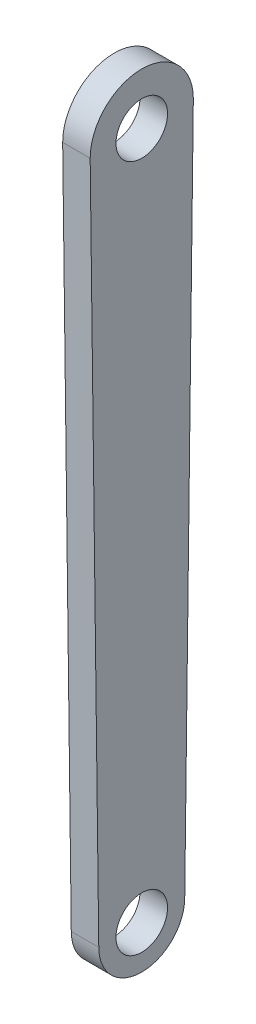
ISO-10303-21;
HEADER;
FILE_DESCRIPTION(('STEP AP214'),'2;1');
FILE_NAME('part.step','',(''),(''),'','','');
FILE_SCHEMA(('AUTOMOTIVE_DESIGN { 1 0 10303 214 1 1 1 1 }'));
ENDSEC;
DATA;
#1=APPLICATION_CONTEXT('core data for automotive mechanical design processes');
#2=APPLICATION_PROTOCOL_DEFINITION('international standard','automotive_design',2000,#1);
#3=PRODUCT_CONTEXT('',#1,'mechanical');
#4=PRODUCT('Part','Part','',(#3));
#5=PRODUCT_RELATED_PRODUCT_CATEGORY('part','',(#4));
#6=PRODUCT_DEFINITION_FORMATION('','',#4);
#7=PRODUCT_DEFINITION_CONTEXT('part definition',#1,'design');
#8=PRODUCT_DEFINITION('design','',#6,#7);
#9=PRODUCT_DEFINITION_SHAPE('','',#8);
#10=(LENGTH_UNIT() NAMED_UNIT(*) SI_UNIT(.MILLI.,.METRE.));
#11=(NAMED_UNIT(*) PLANE_ANGLE_UNIT() SI_UNIT($,.RADIAN.));
#12=(NAMED_UNIT(*) SI_UNIT($,.STERADIAN.) SOLID_ANGLE_UNIT());
#13=UNCERTAINTY_MEASURE_WITH_UNIT(LENGTH_MEASURE(1.E-05),#10,'distance_accuracy_value','');
#14=(GEOMETRIC_REPRESENTATION_CONTEXT(3) GLOBAL_UNCERTAINTY_ASSIGNED_CONTEXT((#13)) GLOBAL_UNIT_ASSIGNED_CONTEXT((#10,
#11,#12)) REPRESENTATION_CONTEXT('',''));
#15=CARTESIAN_POINT('',(0.,0.,0.));
#16=DIRECTION('',(0.,0.,1.));
#17=DIRECTION('',(1.,0.,0.));
#18=AXIS2_PLACEMENT_3D('',#15,#16,#17);
#19=CARTESIAN_POINT('',(8.,-200.,0.));
#20=DIRECTION('',(-1.,0.,0.));
#21=DIRECTION('',(0.,0.,1.));
#22=AXIS2_PLACEMENT_3D('',#19,#20,#21);
#23=CYLINDRICAL_SURFACE('',#22,12.5);
#24=CARTESIAN_POINT('',(0.,-200.,0.));
#25=DIRECTION('',(1.,0.,0.));
#26=DIRECTION('',(0.,0.,-1.));
#27=AXIS2_PLACEMENT_3D('',#24,#25,#26);
#28=CIRCLE('',#27,12.5);
#29=CARTESIAN_POINT('',(0.,-200.,12.5));
#30=VERTEX_POINT('',#29);
#31=CARTESIAN_POINT('',(0.,-200.,-12.5));
#32=VERTEX_POINT('',#31);
#33=EDGE_CURVE('E106',#30,#32,#28,.T.);
#34=ORIENTED_EDGE('',*,*,#33,.T.);
#35=DIRECTION('',(-1.,0.,0.));
#36=VECTOR('',#35,1.);
#37=CARTESIAN_POINT('',(8.,-200.,-12.5));
#38=LINE('',#37,#36);
#39=CARTESIAN_POINT('',(8.,-200.,-12.5));
#40=VERTEX_POINT('',#39);
#41=EDGE_CURVE('E11',#40,#32,#38,.T.);
#42=ORIENTED_EDGE('',*,*,#41,.F.);
#43=CARTESIAN_POINT('',(8.,-200.,0.));
#44=DIRECTION('',(1.,0.,0.));
#45=DIRECTION('',(0.,0.,-1.));
#46=AXIS2_PLACEMENT_3D('',#43,#44,#45);
#47=CIRCLE('',#46,12.5);
#48=CARTESIAN_POINT('',(8.,-200.,12.5));
#49=VERTEX_POINT('',#48);
#50=EDGE_CURVE('E81',#49,#40,#47,.T.);
#51=ORIENTED_EDGE('',*,*,#50,.F.);
#52=DIRECTION('',(-1.,0.,0.));
#53=VECTOR('',#52,1.);
#54=CARTESIAN_POINT('',(8.,-200.,12.5));
#55=LINE('',#54,#53);
#56=EDGE_CURVE('E56',#49,#30,#55,.T.);
#57=ORIENTED_EDGE('',*,*,#56,.T.);
#58=EDGE_LOOP('',(#34,#42,#51,#57));
#59=FACE_BOUND('',#58,.T.);
#60=ADVANCED_FACE('F38',(#59),#23,.T.);
#61=CARTESIAN_POINT('',(8.,-0.187470707701922,-14.9976566161537));
#62=DIRECTION('',(0.,-0.0124990235519261,-0.999921884154082));
#63=DIRECTION('',(0.,0.999921884154082,-0.0124990235519261));
#64=AXIS2_PLACEMENT_3D('',#61,#62,#63);
#65=PLANE('',#64);
#66=DIRECTION('',(0.,-0.999921884154082,0.0124990235519261));
#67=VECTOR('',#66,1.);
#68=CARTESIAN_POINT('',(0.,-0.187470707701922,-14.9976566161537));
#69=LINE('',#68,#67);
#70=CARTESIAN_POINT('',(0.,0.,-15.));
#71=VERTEX_POINT('',#70);
#72=EDGE_CURVE('E91',#71,#32,#69,.T.);
#73=ORIENTED_EDGE('',*,*,#72,.F.);
#74=DIRECTION('',(-1.,0.,0.));
#75=VECTOR('',#74,1.);
#76=CARTESIAN_POINT('',(8.,0.,-15.));
#77=LINE('',#76,#75);
#78=CARTESIAN_POINT('',(8.,0.,-15.));
#79=VERTEX_POINT('',#78);
#80=EDGE_CURVE('E47',#79,#71,#77,.T.);
#81=ORIENTED_EDGE('',*,*,#80,.F.);
#82=DIRECTION('',(0.,-0.999921884154082,0.0124990235519261));
#83=VECTOR('',#82,1.);
#84=CARTESIAN_POINT('',(8.,-0.187470707701922,-14.9976566161537));
#85=LINE('',#84,#83);
#86=EDGE_CURVE('E89',#79,#40,#85,.T.);
#87=ORIENTED_EDGE('',*,*,#86,.T.);
#88=ORIENTED_EDGE('',*,*,#41,.T.);
#89=EDGE_LOOP('',(#73,#81,#87,#88));
#90=FACE_BOUND('',#89,.T.);
#91=ADVANCED_FACE('F88',(#90),#65,.T.);
#92=CARTESIAN_POINT('',(8.,0.,0.));
#93=DIRECTION('',(-1.,0.,0.));
#94=DIRECTION('',(0.,0.,1.));
#95=AXIS2_PLACEMENT_3D('',#92,#93,#94);
#96=CYLINDRICAL_SURFACE('',#95,15.);
#97=CARTESIAN_POINT('',(0.,0.,0.));
#98=DIRECTION('',(1.,0.,0.));
#99=DIRECTION('',(0.,0.,-1.));
#100=AXIS2_PLACEMENT_3D('',#97,#98,#99);
#101=CIRCLE('',#100,15.);
#102=CARTESIAN_POINT('',(0.,0.,15.));
#103=VERTEX_POINT('',#102);
#104=EDGE_CURVE('E109',#71,#103,#101,.T.);
#105=ORIENTED_EDGE('',*,*,#104,.T.);
#106=DIRECTION('',(-1.,0.,0.));
#107=VECTOR('',#106,1.);
#108=CARTESIAN_POINT('',(8.,0.,15.));
#109=LINE('',#108,#107);
#110=CARTESIAN_POINT('',(8.,0.,15.));
#111=VERTEX_POINT('',#110);
#112=EDGE_CURVE('E70',#111,#103,#109,.T.);
#113=ORIENTED_EDGE('',*,*,#112,.F.);
#114=CARTESIAN_POINT('',(8.,0.,0.));
#115=DIRECTION('',(1.,0.,0.));
#116=DIRECTION('',(0.,0.,-1.));
#117=AXIS2_PLACEMENT_3D('',#114,#115,#116);
#118=CIRCLE('',#117,15.);
#119=EDGE_CURVE('E95',#79,#111,#118,.T.);
#120=ORIENTED_EDGE('',*,*,#119,.F.);
#121=ORIENTED_EDGE('',*,*,#80,.T.);
#122=EDGE_LOOP('',(#105,#113,#120,#121));
#123=FACE_BOUND('',#122,.T.);
#124=ADVANCED_FACE('F96',(#123),#96,.T.);
#125=CARTESIAN_POINT('',(8.,-0.187470707701922,14.9976566161537));
#126=DIRECTION('',(0.,-0.0124990235519261,0.999921884154082));
#127=DIRECTION('',(0.,-0.999921884154082,-0.0124990235519261));
#128=AXIS2_PLACEMENT_3D('',#125,#126,#127);
#129=PLANE('',#128);
#130=DIRECTION('',(0.,0.999921884154082,0.0124990235519261));
#131=VECTOR('',#130,1.);
#132=CARTESIAN_POINT('',(0.,-0.187470707701922,14.9976566161537));
#133=LINE('',#132,#131);
#134=EDGE_CURVE('E101',#30,#103,#133,.T.);
#135=ORIENTED_EDGE('',*,*,#134,.F.);
#136=ORIENTED_EDGE('',*,*,#56,.F.);
#137=DIRECTION('',(0.,0.999921884154082,0.0124990235519261));
#138=VECTOR('',#137,1.);
#139=CARTESIAN_POINT('',(8.,-0.187470707701922,14.9976566161537));
#140=LINE('',#139,#138);
#141=EDGE_CURVE('E97',#49,#111,#140,.T.);
#142=ORIENTED_EDGE('',*,*,#141,.T.);
#143=ORIENTED_EDGE('',*,*,#112,.T.);
#144=EDGE_LOOP('',(#135,#136,#142,#143));
#145=FACE_BOUND('',#144,.T.);
#146=ADVANCED_FACE('F133',(#145),#129,.T.);
#147=CARTESIAN_POINT('',(8.,0.,0.));
#148=DIRECTION('',(1.,0.,0.));
#149=DIRECTION('',(0.,0.,-1.));
#150=AXIS2_PLACEMENT_3D('',#147,#148,#149);
#151=PLANE('',#150);
#152=CARTESIAN_POINT('',(8.,0.,0.));
#153=DIRECTION('',(1.,0.,0.));
#154=DIRECTION('',(0.,0.,-1.));
#155=AXIS2_PLACEMENT_3D('',#152,#153,#154);
#156=CIRCLE('',#155,7.5);
#157=CARTESIAN_POINT('',(8.,0.,-7.5));
#158=VERTEX_POINT('',#157);
#159=EDGE_CURVE('E116',#158,#158,#156,.T.);
#160=ORIENTED_EDGE('',*,*,#159,.F.);
#161=EDGE_LOOP('',(#160));
#162=FACE_BOUND('',#161,.T.);
#163=CARTESIAN_POINT('',(8.,-200.,0.));
#164=DIRECTION('',(1.,0.,0.));
#165=DIRECTION('',(0.,0.,-1.));
#166=AXIS2_PLACEMENT_3D('',#163,#164,#165);
#167=CIRCLE('',#166,7.49999999999999);
#168=CARTESIAN_POINT('',(8.,-200.,-7.49999999999999));
#169=VERTEX_POINT('',#168);
#170=EDGE_CURVE('E121',#169,#169,#167,.T.);
#171=ORIENTED_EDGE('',*,*,#170,.F.);
#172=EDGE_LOOP('',(#171));
#173=FACE_BOUND('',#172,.T.);
#174=ORIENTED_EDGE('',*,*,#50,.T.);
#175=ORIENTED_EDGE('',*,*,#86,.F.);
#176=ORIENTED_EDGE('',*,*,#119,.T.);
#177=ORIENTED_EDGE('',*,*,#141,.F.);
#178=EDGE_LOOP('',(#174,#175,#176,#177));
#179=FACE_BOUND('',#178,.T.);
#180=ADVANCED_FACE('F99',(#162,#173,#179),#151,.T.);
#181=CARTESIAN_POINT('',(0.,0.,0.));
#182=DIRECTION('',(1.,0.,0.));
#183=DIRECTION('',(0.,0.,-1.));
#184=AXIS2_PLACEMENT_3D('',#181,#182,#183);
#185=PLANE('',#184);
#186=CARTESIAN_POINT('',(0.,0.,0.));
#187=DIRECTION('',(1.,0.,0.));
#188=DIRECTION('',(0.,0.,-1.));
#189=AXIS2_PLACEMENT_3D('',#186,#187,#188);
#190=CIRCLE('',#189,7.5);
#191=CARTESIAN_POINT('',(0.,0.,-7.5));
#192=VERTEX_POINT('',#191);
#193=EDGE_CURVE('E41',#192,#192,#190,.T.);
#194=ORIENTED_EDGE('',*,*,#193,.T.);
#195=EDGE_LOOP('',(#194));
#196=FACE_BOUND('',#195,.T.);
#197=CARTESIAN_POINT('',(0.,-200.,0.));
#198=DIRECTION('',(1.,0.,0.));
#199=DIRECTION('',(0.,0.,-1.));
#200=AXIS2_PLACEMENT_3D('',#197,#198,#199);
#201=CIRCLE('',#200,7.49999999999999);
#202=CARTESIAN_POINT('',(0.,-200.,-7.49999999999999));
#203=VERTEX_POINT('',#202);
#204=EDGE_CURVE('E114',#203,#203,#201,.T.);
#205=ORIENTED_EDGE('',*,*,#204,.T.);
#206=EDGE_LOOP('',(#205));
#207=FACE_BOUND('',#206,.T.);
#208=ORIENTED_EDGE('',*,*,#33,.F.);
#209=ORIENTED_EDGE('',*,*,#134,.T.);
#210=ORIENTED_EDGE('',*,*,#104,.F.);
#211=ORIENTED_EDGE('',*,*,#72,.T.);
#212=EDGE_LOOP('',(#208,#209,#210,#211));
#213=FACE_BOUND('',#212,.T.);
#214=ADVANCED_FACE('F132',(#196,#207,#213),#185,.F.);
#215=CARTESIAN_POINT('',(-2.,-200.,0.));
#216=DIRECTION('',(1.,0.,0.));
#217=DIRECTION('',(0.,0.,-1.));
#218=AXIS2_PLACEMENT_3D('',#215,#216,#217);
#219=CYLINDRICAL_SURFACE('',#218,7.49999999999999);
#220=ORIENTED_EDGE('',*,*,#170,.T.);
#221=EDGE_LOOP('',(#220));
#222=FACE_BOUND('',#221,.T.);
#223=ORIENTED_EDGE('',*,*,#204,.F.);
#224=EDGE_LOOP('',(#223));
#225=FACE_BOUND('',#224,.T.);
#226=ADVANCED_FACE('F128',(#222,#225),#219,.F.);
#227=CARTESIAN_POINT('',(-2.,0.,0.));
#228=DIRECTION('',(1.,0.,0.));
#229=DIRECTION('',(0.,0.,-1.));
#230=AXIS2_PLACEMENT_3D('',#227,#228,#229);
#231=CYLINDRICAL_SURFACE('',#230,7.5);
#232=ORIENTED_EDGE('',*,*,#159,.T.);
#233=EDGE_LOOP('',(#232));
#234=FACE_BOUND('',#233,.T.);
#235=ORIENTED_EDGE('',*,*,#193,.F.);
#236=EDGE_LOOP('',(#235));
#237=FACE_BOUND('',#236,.T.);
#238=ADVANCED_FACE('F182',(#234,#237),#231,.F.);
#239=CLOSED_SHELL('',(#60,#91,#124,#146,#180,#214,#226,#238));
#240=MANIFOLD_SOLID_BREP('B2',#239);
#241=ADVANCED_BREP_SHAPE_REPRESENTATION('',(#18,#240),#14);
#242=SHAPE_DEFINITION_REPRESENTATION(#9,#241);
ENDSEC;
END-ISO-10303-21;
